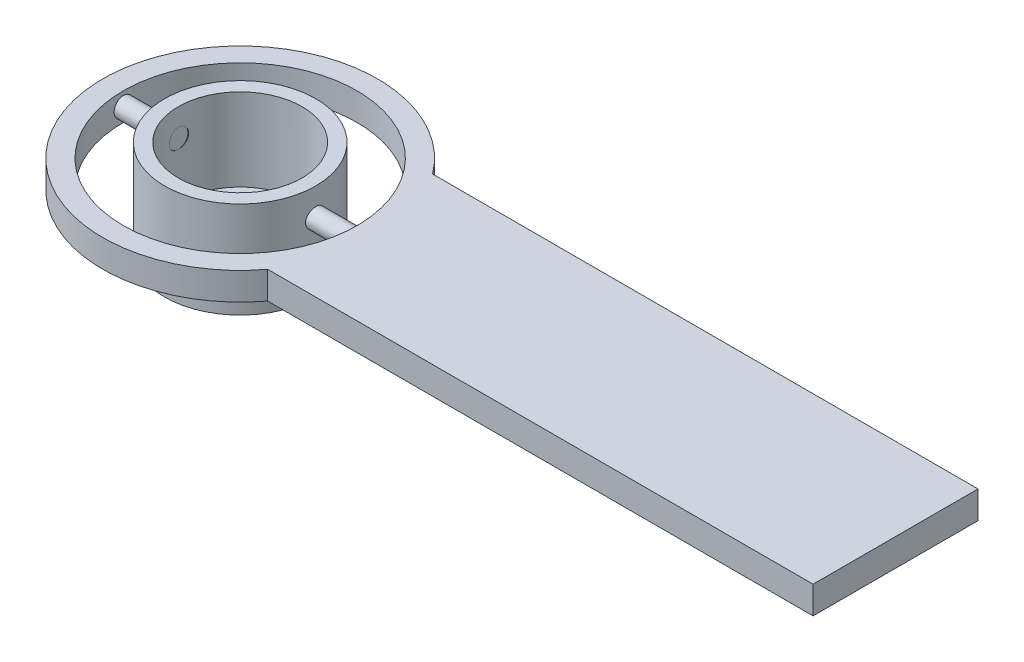
ISO-10303-21;
HEADER;
FILE_DESCRIPTION(('STEP AP214'),'2;1');
FILE_NAME('part.step','',(''),(''),'','','');
FILE_SCHEMA(('AUTOMOTIVE_DESIGN { 1 0 10303 214 1 1 1 1 }'));
ENDSEC;
DATA;
#1=APPLICATION_CONTEXT('core data for automotive mechanical design processes');
#2=APPLICATION_PROTOCOL_DEFINITION('international standard','automotive_design',2000,#1);
#3=PRODUCT_CONTEXT('',#1,'mechanical');
#4=PRODUCT('Part','Part','',(#3));
#5=PRODUCT_RELATED_PRODUCT_CATEGORY('part','',(#4));
#6=PRODUCT_DEFINITION_FORMATION('','',#4);
#7=PRODUCT_DEFINITION_CONTEXT('part definition',#1,'design');
#8=PRODUCT_DEFINITION('design','',#6,#7);
#9=PRODUCT_DEFINITION_SHAPE('','',#8);
#10=(LENGTH_UNIT() NAMED_UNIT(*) SI_UNIT(.MILLI.,.METRE.));
#11=(NAMED_UNIT(*) PLANE_ANGLE_UNIT() SI_UNIT($,.RADIAN.));
#12=(NAMED_UNIT(*) SI_UNIT($,.STERADIAN.) SOLID_ANGLE_UNIT());
#13=UNCERTAINTY_MEASURE_WITH_UNIT(LENGTH_MEASURE(1.E-05),#10,'distance_accuracy_value','');
#14=(GEOMETRIC_REPRESENTATION_CONTEXT(3) GLOBAL_UNCERTAINTY_ASSIGNED_CONTEXT((#13)) GLOBAL_UNIT_ASSIGNED_CONTEXT((#10,
#11,#12)) REPRESENTATION_CONTEXT('',''));
#15=CARTESIAN_POINT('',(0.,0.,0.));
#16=DIRECTION('',(0.,0.,1.));
#17=DIRECTION('',(1.,0.,0.));
#18=AXIS2_PLACEMENT_3D('',#15,#16,#17);
#19=CARTESIAN_POINT('',(0.,-5.,0.));
#20=DIRECTION('',(0.,1.,0.));
#21=DIRECTION('',(0.,0.,1.));
#22=AXIS2_PLACEMENT_3D('',#19,#20,#21);
#23=CYLINDRICAL_SURFACE('',#22,42.5);
#24=CARTESIAN_POINT('',(0.,5.,0.));
#25=DIRECTION('',(0.,1.,0.));
#26=DIRECTION('',(0.,0.,1.));
#27=AXIS2_PLACEMENT_3D('',#24,#25,#26);
#28=CIRCLE('',#27,42.5);
#29=CARTESIAN_POINT('',(0.,5.,42.5));
#30=VERTEX_POINT('',#29);
#31=EDGE_CURVE('E187',#30,#30,#28,.T.);
#32=ORIENTED_EDGE('',*,*,#31,.T.);
#33=EDGE_LOOP('',(#32));
#34=FACE_BOUND('',#33,.T.);
#35=CARTESIAN_POINT('',(0.,-5.,0.));
#36=DIRECTION('',(0.,1.,0.));
#37=DIRECTION('',(0.,0.,1.));
#38=AXIS2_PLACEMENT_3D('',#35,#36,#37);
#39=CIRCLE('',#38,42.5);
#40=CARTESIAN_POINT('',(0.,-5.,42.5));
#41=VERTEX_POINT('',#40);
#42=EDGE_CURVE('E218',#41,#41,#39,.T.);
#43=ORIENTED_EDGE('',*,*,#42,.F.);
#44=EDGE_LOOP('',(#43));
#45=FACE_BOUND('',#44,.T.);
#46=CARTESIAN_POINT('',(42.3556371690947,0.,-3.5));
#47=CARTESIAN_POINT('',(42.3556390824974,-0.196238562845595,-3.49999142396466));
#48=CARTESIAN_POINT('',(42.3570156431992,-0.392610925565576,-3.48344037676546));
#49=CARTESIAN_POINT('',(42.362373136931,-0.779922876674009,-3.41765842155794));
#50=CARTESIAN_POINT('',(42.3663570251593,-0.970856043611473,-3.36839043056702));
#51=CARTESIAN_POINT('',(42.3764749055132,-1.34162393102458,-3.23860861566859));
#52=CARTESIAN_POINT('',(42.3826076829928,-1.52146485392668,-3.15811244054555));
#53=CARTESIAN_POINT('',(42.3963308123219,-1.8650395927381,-2.9681904928212));
#54=CARTESIAN_POINT('',(42.4039208512832,-2.0287768548663,-2.85877092845301));
#55=CARTESIAN_POINT('',(42.419724696405,-2.33595043375593,-2.61381126613576));
#56=CARTESIAN_POINT('',(42.4279398531564,-2.47934076017376,-2.47821357933678));
#57=CARTESIAN_POINT('',(42.4440559131641,-2.74135510608754,-2.18486852075023));
#58=CARTESIAN_POINT('',(42.4519568027125,-2.85997804621193,-2.02712018413027));
#59=CARTESIAN_POINT('',(42.4665668581017,-3.06924288660358,-1.69367801019659));
#60=CARTESIAN_POINT('',(42.4732743263355,-3.15984506118019,-1.5179591607319));
#61=CARTESIAN_POINT('',(42.484727249011,-3.31024239322861,-1.15373848914464));
#62=CARTESIAN_POINT('',(42.4894727370791,-3.37003807869987,-0.965236886171281));
#63=CARTESIAN_POINT('',(42.496457577203,-3.45699285033513,-0.581258796771895));
#64=CARTESIAN_POINT('',(42.4987026354703,-3.48422625712401,-0.385799246257355));
#65=CARTESIAN_POINT('',(42.50045298983,-3.50551315243999,0.0069285738195056));
#66=CARTESIAN_POINT('',(42.4999583358006,-3.49956724501707,0.204196810388299));
#67=CARTESIAN_POINT('',(42.4962897108242,-3.45472510313356,0.594438373880778));
#68=CARTESIAN_POINT('',(42.4931222387046,-3.4159087906562,0.787420954125839));
#69=CARTESIAN_POINT('',(42.4844717400003,-3.3065519496229,1.16412243392015));
#70=CARTESIAN_POINT('',(42.4789886918215,-3.23601112521537,1.34784124706102));
#71=CARTESIAN_POINT('',(42.4663127361263,-3.06511850444177,1.70105452805894));
#72=CARTESIAN_POINT('',(42.45911777639,-2.9647308917579,1.87053159053581));
#73=CARTESIAN_POINT('',(42.4438266196338,-2.73702033879631,2.19026056185741));
#74=CARTESIAN_POINT('',(42.4357304047691,-2.60969686514175,2.34051208990859));
#75=CARTESIAN_POINT('',(42.4195183197154,-2.33127834104207,2.61799215487233));
#76=CARTESIAN_POINT('',(42.4114024625222,-2.18011384764526,2.74515102506004));
#77=CARTESIAN_POINT('',(42.3960899915867,-1.85854636547038,2.97229802875737));
#78=CARTESIAN_POINT('',(42.3888933785767,-1.68814336136661,3.07228614062213));
#79=CARTESIAN_POINT('',(42.3762328603373,-1.33288730553243,3.24225055734327));
#80=CARTESIAN_POINT('',(42.370769161768,-1.14803253361871,3.31222328304051));
#81=CARTESIAN_POINT('',(42.362197054903,-0.769143466624363,3.42011926500076));
#82=CARTESIAN_POINT('',(42.3590885982647,-0.575109360041201,3.45804317908412));
#83=CARTESIAN_POINT('',(42.3555867233006,-0.18397905375624,3.50067689798851));
#84=CARTESIAN_POINT('',(42.3551853649273,0.0131064900730963,3.5054838373549));
#85=CARTESIAN_POINT('',(42.3571221697015,0.405280620107081,3.48200156342021));
#86=CARTESIAN_POINT('',(42.3594603079033,0.600369224479479,3.45371265148891));
#87=CARTESIAN_POINT('',(42.3666054134299,0.982732990111804,3.36492265556402));
#88=CARTESIAN_POINT('',(42.3714089086124,1.17001874069163,3.3044668701462));
#89=CARTESIAN_POINT('',(42.3829406074212,1.53178840225704,3.15310528681497));
#90=CARTESIAN_POINT('',(42.3896688412201,1.70627211250188,3.06219901155092));
#91=CARTESIAN_POINT('',(42.404311157744,2.03792932526735,2.85227102392097));
#92=CARTESIAN_POINT('',(42.4122279557951,2.19506172315144,2.73318456414984));
#93=CARTESIAN_POINT('',(42.4283461700472,2.48714053384217,2.47037018473524));
#94=CARTESIAN_POINT('',(42.4365475910306,2.62208657365889,2.32664185090348));
#95=CARTESIAN_POINT('',(42.452334570173,2.86629341331444,2.01820398520797));
#96=CARTESIAN_POINT('',(42.4599185862065,2.97549111565585,1.85344440588786));
#97=CARTESIAN_POINT('',(42.4735940126989,3.16466868475902,1.50787045966564));
#98=CARTESIAN_POINT('',(42.479685437773,3.24464883761565,1.32705624999017));
#99=CARTESIAN_POINT('',(42.4896822310036,3.37301252936571,0.954732104171517));
#100=CARTESIAN_POINT('',(42.4935903012304,3.42143513558018,0.763235712474859));
#101=CARTESIAN_POINT('',(42.498791011139,3.48543688762004,0.374797175975393));
#102=CARTESIAN_POINT('',(42.5000836990535,3.50101663913003,0.177855131668618));
#103=CARTESIAN_POINT('',(42.4999080717487,3.49888343501126,-0.215262150395223));
#104=CARTESIAN_POINT('',(42.4984479133168,3.48126883556045,-0.411437933017632));
#105=CARTESIAN_POINT('',(42.4929467994317,3.4134519866711,-0.798035003218845));
#106=CARTESIAN_POINT('',(42.4889058404068,3.36324969213241,-0.988456282833249));
#107=CARTESIAN_POINT('',(42.4786965662692,3.23170737688277,-1.35814578352328));
#108=CARTESIAN_POINT('',(42.4725283675252,3.15036905941142,-1.53741461404989));
#109=CARTESIAN_POINT('',(42.4587548115147,2.95887495442643,-1.87976808217458));
#110=CARTESIAN_POINT('',(42.4511494777461,2.84871963807198,-2.04285298432047));
#111=CARTESIAN_POINT('',(42.4353285594405,2.60234937998688,-2.34871243994367));
#112=CARTESIAN_POINT('',(42.4271113117974,2.46606170596259,-2.49142832104244));
#113=CARTESIAN_POINT('',(42.4110068308549,2.17142575586439,-2.75201616144308));
#114=CARTESIAN_POINT('',(42.4031196780042,2.01307214226618,-2.86988209241012));
#115=CARTESIAN_POINT('',(42.3885526526316,1.67849888435527,-3.07757984890701));
#116=CARTESIAN_POINT('',(42.3818750270933,1.50224691825686,-3.1673597183125));
#117=CARTESIAN_POINT('',(42.3705105970598,1.13723578384828,-3.31593660476885));
#118=CARTESIAN_POINT('',(42.3658215026415,0.94849129277366,-3.3747692784103));
#119=CARTESIAN_POINT('',(42.3601722277646,0.63219251740419,-3.44478130227619));
#120=CARTESIAN_POINT('',(42.3584793868734,0.506673085525695,-3.46546082815173));
#121=CARTESIAN_POINT('',(42.3562112394166,0.254121139050787,-3.49307293607272));
#122=CARTESIAN_POINT('',(42.355635929931,0.127088628408903,-3.50000555403868));
#123=CARTESIAN_POINT('',(42.3556371690947,0.,-3.5));
#124=B_SPLINE_CURVE_WITH_KNOTS('',3,(#46,#47,#48,#49,#50,#51,#52,#53,#54,#55,#56,#57,#58,#59,
#60,#61,#62,#63,#64,#65,#66,#67,#68,#69,#70,#71,#72,#73,#74,#75,#76,#77,#78,#79,#80,#81,#82,#83,
#84,#85,#86,#87,#88,#89,#90,#91,#92,#93,#94,#95,#96,#97,#98,#99,#100,#101,#102,#103,#104,#105,
#106,#107,#108,#109,#110,#111,#112,#113,#114,#115,#116,#117,#118,#119,#120,#121,#122,#123),
.UNSPECIFIED.,.T.,.F.,(4,2,2,2,2,2,2,2,2,2,2,2,2,2,2,2,2,2,2,2,2,2,2,2,2,2,2,2,2,2,2,2,2,2,2,2,
2,2,4),(0.,0.588251667803966,1.17717122943579,1.76575844358384,2.35421942343748,
2.94399001266809,3.53378629895001,4.1244149601432,4.71503349808014,5.30430141048681,
5.89355859494112,6.48138714386103,7.06922117477629,7.65776347675657,8.24631743398799,
8.83661848805551,9.4269200123695,10.0172919071315,10.6076516838755,11.1962791515735,
11.7849012592901,12.3726966330962,12.9605012217826,13.5496697057033,14.1388480935223,
14.7294556241908,15.3200573715435,15.9099265752769,16.4997849006074,17.0878981999208,
17.6760123131628,18.2640942592867,18.852166590846,19.4419000639927,20.0317764360423,
20.6227376485765,21.2130164705687,21.5939828407072,21.9749482153838),.UNSPECIFIED.);
#125=CARTESIAN_POINT('',(42.3556371690947,0.,-3.5));
#126=VERTEX_POINT('',#125);
#127=EDGE_CURVE('E12',#126,#126,#124,.T.);
#128=ORIENTED_EDGE('',*,*,#127,.F.);
#129=EDGE_LOOP('',(#128));
#130=FACE_BOUND('',#129,.T.);
#131=CARTESIAN_POINT('',(-42.3556371690947,0.,3.5));
#132=CARTESIAN_POINT('',(-42.3556390824974,-0.196238562845595,3.49999142396466));
#133=CARTESIAN_POINT('',(-42.3570156431992,-0.392610925565576,3.48344037676546));
#134=CARTESIAN_POINT('',(-42.362373136931,-0.779922876674009,3.41765842155794));
#135=CARTESIAN_POINT('',(-42.3663570251593,-0.970856043611473,3.36839043056702));
#136=CARTESIAN_POINT('',(-42.3764749055132,-1.34162393102458,3.23860861566859));
#137=CARTESIAN_POINT('',(-42.3826076829928,-1.52146485392668,3.15811244054555));
#138=CARTESIAN_POINT('',(-42.3963308123219,-1.8650395927381,2.9681904928212));
#139=CARTESIAN_POINT('',(-42.4039208512832,-2.0287768548663,2.85877092845301));
#140=CARTESIAN_POINT('',(-42.419724696405,-2.33595043375593,2.61381126613576));
#141=CARTESIAN_POINT('',(-42.4279398531564,-2.47934076017376,2.47821357933678));
#142=CARTESIAN_POINT('',(-42.4440559131641,-2.74135510608754,2.18486852075023));
#143=CARTESIAN_POINT('',(-42.4519568027125,-2.85997804621193,2.02712018413027));
#144=CARTESIAN_POINT('',(-42.4665668581017,-3.06924288660358,1.69367801019659));
#145=CARTESIAN_POINT('',(-42.4732743263355,-3.15984506118019,1.5179591607319));
#146=CARTESIAN_POINT('',(-42.484727249011,-3.31024239322861,1.15373848914464));
#147=CARTESIAN_POINT('',(-42.4894727370791,-3.37003807869987,0.965236886171281));
#148=CARTESIAN_POINT('',(-42.496457577203,-3.45699285033513,0.581258796771895));
#149=CARTESIAN_POINT('',(-42.4987026354703,-3.48422625712401,0.385799246257355));
#150=CARTESIAN_POINT('',(-42.50045298983,-3.50551315243999,-0.00692857381950514));
#151=CARTESIAN_POINT('',(-42.4999583358006,-3.49956724501707,-0.204196810388298));
#152=CARTESIAN_POINT('',(-42.4962897108242,-3.45472510313356,-0.594438373880777));
#153=CARTESIAN_POINT('',(-42.4931222387046,-3.4159087906562,-0.787420954125838));
#154=CARTESIAN_POINT('',(-42.4844717400003,-3.3065519496229,-1.16412243392015));
#155=CARTESIAN_POINT('',(-42.4789886918215,-3.23601112521537,-1.34784124706101));
#156=CARTESIAN_POINT('',(-42.4663127361263,-3.06511850444177,-1.70105452805894));
#157=CARTESIAN_POINT('',(-42.45911777639,-2.9647308917579,-1.87053159053581));
#158=CARTESIAN_POINT('',(-42.4438266196338,-2.73702033879631,-2.19026056185741));
#159=CARTESIAN_POINT('',(-42.4357304047691,-2.60969686514175,-2.34051208990859));
#160=CARTESIAN_POINT('',(-42.4195183197154,-2.33127834104207,-2.61799215487233));
#161=CARTESIAN_POINT('',(-42.4114024625222,-2.18011384764526,-2.74515102506004));
#162=CARTESIAN_POINT('',(-42.3960899915867,-1.85854636547038,-2.97229802875737));
#163=CARTESIAN_POINT('',(-42.3888933785767,-1.68814336136661,-3.07228614062213));
#164=CARTESIAN_POINT('',(-42.3762328603373,-1.33288730553243,-3.24225055734327));
#165=CARTESIAN_POINT('',(-42.370769161768,-1.14803253361871,-3.31222328304051));
#166=CARTESIAN_POINT('',(-42.362197054903,-0.769143466624364,-3.42011926500076));
#167=CARTESIAN_POINT('',(-42.3590885982647,-0.575109360041202,-3.45804317908412));
#168=CARTESIAN_POINT('',(-42.3555867233006,-0.183979053756241,-3.50067689798851));
#169=CARTESIAN_POINT('',(-42.3551853649273,0.0131064900730951,-3.5054838373549));
#170=CARTESIAN_POINT('',(-42.3571221697015,0.40528062010708,-3.48200156342021));
#171=CARTESIAN_POINT('',(-42.3594603079033,0.600369224479478,-3.45371265148891));
#172=CARTESIAN_POINT('',(-42.3666054134299,0.982732990111803,-3.36492265556402));
#173=CARTESIAN_POINT('',(-42.3714089086124,1.17001874069163,-3.30446687014621));
#174=CARTESIAN_POINT('',(-42.3829406074212,1.53178840225704,-3.15310528681497));
#175=CARTESIAN_POINT('',(-42.3896688412201,1.70627211250188,-3.06219901155092));
#176=CARTESIAN_POINT('',(-42.404311157744,2.03792932526735,-2.85227102392097));
#177=CARTESIAN_POINT('',(-42.4122279557951,2.19506172315144,-2.73318456414984));
#178=CARTESIAN_POINT('',(-42.4283461700472,2.48714053384217,-2.47037018473524));
#179=CARTESIAN_POINT('',(-42.4365475910306,2.62208657365889,-2.32664185090348));
#180=CARTESIAN_POINT('',(-42.452334570173,2.86629341331444,-2.01820398520797));
#181=CARTESIAN_POINT('',(-42.4599185862065,2.97549111565586,-1.85344440588786));
#182=CARTESIAN_POINT('',(-42.4735940126989,3.16466868475902,-1.50787045966564));
#183=CARTESIAN_POINT('',(-42.479685437773,3.24464883761565,-1.32705624999017));
#184=CARTESIAN_POINT('',(-42.4896822310036,3.37301252936571,-0.954732104171519));
#185=CARTESIAN_POINT('',(-42.4935903012304,3.42143513558017,-0.763235712474861));
#186=CARTESIAN_POINT('',(-42.498791011139,3.48543688762004,-0.374797175975395));
#187=CARTESIAN_POINT('',(-42.5000836990535,3.50101663913003,-0.17785513166862));
#188=CARTESIAN_POINT('',(-42.4999080717487,3.49888343501126,0.215262150395221));
#189=CARTESIAN_POINT('',(-42.4984479133168,3.48126883556045,0.411437933017631));
#190=CARTESIAN_POINT('',(-42.4929467994317,3.4134519866711,0.798035003218843));
#191=CARTESIAN_POINT('',(-42.4889058404068,3.36324969213241,0.988456282833247));
#192=CARTESIAN_POINT('',(-42.4786965662692,3.23170737688277,1.35814578352328));
#193=CARTESIAN_POINT('',(-42.4725283675252,3.15036905941142,1.53741461404989));
#194=CARTESIAN_POINT('',(-42.4587548115147,2.95887495442644,1.87976808217458));
#195=CARTESIAN_POINT('',(-42.4511494777461,2.84871963807198,2.04285298432047));
#196=CARTESIAN_POINT('',(-42.4353285594405,2.60234937998688,2.34871243994366));
#197=CARTESIAN_POINT('',(-42.4271113117974,2.46606170596259,2.49142832104243));
#198=CARTESIAN_POINT('',(-42.4110068308549,2.17142575586439,2.75201616144308));
#199=CARTESIAN_POINT('',(-42.4031196780042,2.01307214226619,2.86988209241011));
#200=CARTESIAN_POINT('',(-42.3885526526316,1.67849888435527,3.07757984890701));
#201=CARTESIAN_POINT('',(-42.3818750270933,1.50224691825686,3.16735971831249));
#202=CARTESIAN_POINT('',(-42.3705105970598,1.13723578384829,3.31593660476885));
#203=CARTESIAN_POINT('',(-42.3658215026415,0.948491292773664,3.3747692784103));
#204=CARTESIAN_POINT('',(-42.3601722277646,0.632192517404193,3.44478130227619));
#205=CARTESIAN_POINT('',(-42.3584793868734,0.506673085525699,3.46546082815173));
#206=CARTESIAN_POINT('',(-42.3562112394166,0.254121139050789,3.49307293607272));
#207=CARTESIAN_POINT('',(-42.355635929931,0.127088628408904,3.50000555403868));
#208=CARTESIAN_POINT('',(-42.3556371690947,0.,3.5));
#209=B_SPLINE_CURVE_WITH_KNOTS('',3,(#131,#132,#133,#134,#135,#136,#137,#138,#139,#140,#141,
#142,#143,#144,#145,#146,#147,#148,#149,#150,#151,#152,#153,#154,#155,#156,#157,#158,#159,#160,
#161,#162,#163,#164,#165,#166,#167,#168,#169,#170,#171,#172,#173,#174,#175,#176,#177,#178,#179,
#180,#181,#182,#183,#184,#185,#186,#187,#188,#189,#190,#191,#192,#193,#194,#195,#196,#197,#198,
#199,#200,#201,#202,#203,#204,#205,#206,#207,#208),.UNSPECIFIED.,.T.,.F.,(4,2,2,2,2,2,2,2,2,2,2,
2,2,2,2,2,2,2,2,2,2,2,2,2,2,2,2,2,2,2,2,2,2,2,2,2,2,2,4),(0.,0.588251667803966,1.17717122943579,
1.76575844358384,2.35421942343748,2.94399001266809,3.53378629895001,4.1244149601432,
4.71503349808014,5.30430141048681,5.89355859494112,6.48138714386103,7.06922117477629,
7.65776347675657,8.24631743398799,8.83661848805551,9.42692001236949,10.0172919071315,
10.6076516838755,11.1962791515735,11.7849012592901,12.3726966330962,12.9605012217826,
13.5496697057033,14.1388480935223,14.7294556241908,15.3200573715435,15.9099265752769,
16.4997849006074,17.0878981999208,17.6760123131628,18.2640942592867,18.852166590846,
19.4419000639927,20.0317764360423,20.6227376485765,21.2130164705687,21.5939828407072,
21.9749482153838),.UNSPECIFIED.);
#210=CARTESIAN_POINT('',(-42.3556371690947,0.,3.5));
#211=VERTEX_POINT('',#210);
#212=EDGE_CURVE('E122',#211,#211,#209,.T.);
#213=ORIENTED_EDGE('',*,*,#212,.F.);
#214=EDGE_LOOP('',(#213));
#215=FACE_BOUND('',#214,.T.);
#216=ADVANCED_FACE('F59',(#34,#45,#130,#215),#23,.F.);
#217=CARTESIAN_POINT('',(27.501,0.,0.));
#218=DIRECTION('',(-1.,0.,0.));
#219=DIRECTION('',(0.,0.,1.));
#220=AXIS2_PLACEMENT_3D('',#217,#218,#219);
#221=CYLINDRICAL_SURFACE('',#220,3.5);
#222=CARTESIAN_POINT('',(-22.5,0.,0.));
#223=DIRECTION('',(1.,0.,0.));
#224=DIRECTION('',(0.,0.,-1.));
#225=AXIS2_PLACEMENT_3D('',#222,#223,#224);
#226=CIRCLE('',#225,3.5);
#227=CARTESIAN_POINT('',(-22.5,3.5,0.));
#228=VERTEX_POINT('',#227);
#229=CARTESIAN_POINT('',(-22.5,-3.5,0.));
#230=VERTEX_POINT('',#229);
#231=EDGE_CURVE('E123',#228,#230,#226,.T.);
#232=ORIENTED_EDGE('',*,*,#231,.F.);
#233=CARTESIAN_POINT('',(-22.2261107708929,0.,3.5));
#234=CARTESIAN_POINT('',(-22.2261141274381,0.19531622600666,3.49999199932989));
#235=CARTESIAN_POINT('',(-22.2287132114458,0.390743671342416,3.48359536070723));
#236=CARTESIAN_POINT('',(-22.2388209026934,0.776128377761643,3.41846300815229));
#237=CARTESIAN_POINT('',(-22.2463342144307,0.966080214810538,3.3696963049871));
#238=CARTESIAN_POINT('',(-22.2653992658192,1.33487989252108,3.24132348210851));
#239=CARTESIAN_POINT('',(-22.2769478168358,1.51373636968556,3.16174170702204));
#240=CARTESIAN_POINT('',(-22.3027783375543,1.85553417195683,2.97405620485814));
#241=CARTESIAN_POINT('',(-22.3170599530873,2.01847755506141,2.86595617268124));
#242=CARTESIAN_POINT('',(-22.3468847405485,2.32524867680305,2.62331013798504));
#243=CARTESIAN_POINT('',(-22.3624367736815,2.46891968908001,2.4885670540169));
#244=CARTESIAN_POINT('',(-22.3929711076182,2.73170860007246,2.19688547464603));
#245=CARTESIAN_POINT('',(-22.4079533762861,2.8508251155327,2.03994572965387));
#246=CARTESIAN_POINT('',(-22.4357531554861,3.061705324158,1.70731791031633));
#247=CARTESIAN_POINT('',(-22.4485590545345,3.15332418248335,1.53153696002179));
#248=CARTESIAN_POINT('',(-22.4704649182686,3.30567842295971,1.16684873211662));
#249=CARTESIAN_POINT('',(-22.4795650932445,3.36641555761535,0.977942200060336));
#250=CARTESIAN_POINT('',(-22.4929716378829,3.45480573232831,0.593981035483121));
#251=CARTESIAN_POINT('',(-22.4973160606297,3.48272152727484,0.398988240953517));
#252=CARTESIAN_POINT('',(-22.5008521262826,3.50549284955333,0.00704109791545041));
#253=CARTESIAN_POINT('',(-22.5000440761977,3.5003503466578,-0.189913133022986));
#254=CARTESIAN_POINT('',(-22.4933965552525,3.4573576189065,-0.578398429706621));
#255=CARTESIAN_POINT('',(-22.4876005752428,3.41979010649582,-0.769961632640021));
#256=CARTESIAN_POINT('',(-22.471676886101,3.3134579834311,-1.14403161700396));
#257=CARTESIAN_POINT('',(-22.4615490587275,3.24469252119906,-1.32653815107315));
#258=CARTESIAN_POINT('',(-22.4380251015873,3.0776298077764,-1.67816499605679));
#259=CARTESIAN_POINT('',(-22.424615931438,2.97921435466676,-1.84722823970001));
#260=CARTESIAN_POINT('',(-22.3960222427278,2.75573170628052,-2.1665472496407));
#261=CARTESIAN_POINT('',(-22.3808375986714,2.63066262653408,-2.31680168492121));
#262=CARTESIAN_POINT('',(-22.3501953598738,2.35585025004684,-2.59590566546295));
#263=CARTESIAN_POINT('',(-22.334736576738,2.20586003262427,-2.72451207619521));
#264=CARTESIAN_POINT('',(-22.3054445550795,1.88629972137738,-2.95476856027025));
#265=CARTESIAN_POINT('',(-22.2916113280541,1.71672948908445,-3.05641844296145));
#266=CARTESIAN_POINT('',(-22.2671366787338,1.36256002006903,-3.22991404443639));
#267=CARTESIAN_POINT('',(-22.2564980825166,1.17794765901405,-3.30173339552143));
#268=CARTESIAN_POINT('',(-22.2396661439954,0.799078087169444,-3.41327734162307));
#269=CARTESIAN_POINT('',(-22.2334724634806,0.604821611397052,-3.4530043785519));
#270=CARTESIAN_POINT('',(-22.2262962033391,0.214345169903353,-3.49889967595408));
#271=CARTESIAN_POINT('',(-22.2252600102673,0.0181667391653879,-3.50541321697519));
#272=CARTESIAN_POINT('',(-22.2283735578185,-0.372479188601877,-3.48561408152108));
#273=CARTESIAN_POINT('',(-22.2325231249271,-0.566946742657487,-3.45930250336717));
#274=CARTESIAN_POINT('',(-22.2454912996713,-0.947572290332169,-3.37489336532265));
#275=CARTESIAN_POINT('',(-22.2542844545574,-1.13376964143558,-3.31696902609833));
#276=CARTESIAN_POINT('',(-22.2755279299359,-1.49381307924929,-3.17115929002653));
#277=CARTESIAN_POINT('',(-22.287978443484,-1.66765851335532,-3.08327231154577));
#278=CARTESIAN_POINT('',(-22.3152595291601,-1.9996075065717,-2.879207239903));
#279=CARTESIAN_POINT('',(-22.3301085139179,-2.15757256751682,-2.76280635888511));
#280=CARTESIAN_POINT('',(-22.3604585024315,-2.4518504145764,-2.50532611597574));
#281=CARTESIAN_POINT('',(-22.3759595458903,-2.58816187980815,-2.3642452496921));
#282=CARTESIAN_POINT('',(-22.4060352917262,-2.8365098698539,-2.05988623823672));
#283=CARTESIAN_POINT('',(-22.420600411578,-2.94831710360054,-1.89641991032536));
#284=CARTESIAN_POINT('',(-22.4470127819162,-3.14288258666365,-1.55282440307782));
#285=CARTESIAN_POINT('',(-22.4588601112561,-3.22564167881464,-1.37269570739343));
#286=CARTESIAN_POINT('',(-22.4784601514089,-3.3593983547314,-1.00159331862635));
#287=CARTESIAN_POINT('',(-22.4862287819182,-3.41051956719214,-0.810665061627113));
#288=CARTESIAN_POINT('',(-22.4968630928652,-3.47994882110329,-0.4228037830431));
#289=CARTESIAN_POINT('',(-22.499729122652,-3.49825920058958,-0.225871190332697));
#290=CARTESIAN_POINT('',(-22.5002313450679,-3.50148666528254,0.166188208897424));
#291=CARTESIAN_POINT('',(-22.4979223828698,-3.48675394398843,0.361312152194307));
#292=CARTESIAN_POINT('',(-22.4884450879238,-3.42506623710617,0.746271607267873));
#293=CARTESIAN_POINT('',(-22.4812767742656,-3.37811137810216,0.93610713981694));
#294=CARTESIAN_POINT('',(-22.4628827065204,-3.25343983426105,1.30499271033077));
#295=CARTESIAN_POINT('',(-22.4516603880013,-3.17574919118791,1.48405173140909));
#296=CARTESIAN_POINT('',(-22.4263884871186,-2.99184927345523,1.82664746653963));
#297=CARTESIAN_POINT('',(-22.412338799153,-2.88563893353758,1.99018360047731));
#298=CARTESIAN_POINT('',(-22.3827957094145,-2.64645617431542,2.29886379111357));
#299=CARTESIAN_POINT('',(-22.3672892325369,-2.51322584519353,2.4438067729095));
#300=CARTESIAN_POINT('',(-22.3366749331415,-2.22432754261112,2.70940464310382));
#301=CARTESIAN_POINT('',(-22.3215672049379,-2.06865431611924,2.83005382935615));
#302=CARTESIAN_POINT('',(-22.2933622652195,-1.73817274845835,3.04430309276387));
#303=CARTESIAN_POINT('',(-22.2802778300441,-1.56325386825404,3.13773433039402));
#304=CARTESIAN_POINT('',(-22.2577510719313,-1.20008084138986,3.29374927814051));
#305=CARTESIAN_POINT('',(-22.24830501676,-1.01184059569863,3.35636461748451));
#306=CARTESIAN_POINT('',(-22.2362788979994,-0.685658405740137,3.43495590873849));
#307=CARTESIAN_POINT('',(-22.2324863811603,-0.549718875196619,3.45930954507756));
#308=CARTESIAN_POINT('',(-22.2274011502965,-0.275871374742544,3.49183429886821));
#309=CARTESIAN_POINT('',(-22.2261083999659,-0.137963433450059,3.50000565134777));
#310=CARTESIAN_POINT('',(-22.2261107708929,0.,3.5));
#311=B_SPLINE_CURVE_WITH_KNOTS('',3,(#233,#234,#235,#236,#237,#238,#239,#240,#241,#242,#243,
#244,#245,#246,#247,#248,#249,#250,#251,#252,#253,#254,#255,#256,#257,#258,#259,#260,#261,#262,
#263,#264,#265,#266,#267,#268,#269,#270,#271,#272,#273,#274,#275,#276,#277,#278,#279,#280,#281,
#282,#283,#284,#285,#286,#287,#288,#289,#290,#291,#292,#293,#294,#295,#296,#297,#298,#299,#300,
#301,#302,#303,#304,#305,#306,#307,#308,#309,#310),.UNSPECIFIED.,.T.,.F.,(4,2,2,2,2,2,2,2,2,2,2,
2,2,2,2,2,2,2,2,2,2,2,2,2,2,2,2,2,2,2,2,2,2,2,2,2,2,2,4),(0.,0.585444332011793,1.17144994457482,
1.75699354047962,2.3424613090399,2.93243379464048,3.52243950672744,4.11550043787179,
4.70852770968834,5.29677439130335,5.8849860226744,6.46812027914766,7.05127045378839,
7.63677687419945,8.22232470493977,8.81406410301299,9.40580768608546,9.99807321364631,
10.5902936713285,11.1763447928384,11.7623763057318,12.3452284633785,12.9281113927181,
13.515702573049,14.1033295830518,14.6962402975511,15.2891338072689,15.8796956413697,
16.4702153915137,17.05450637065,17.6387950544221,18.2225897396632,18.8064062336409,
19.396082460622,19.9858969332119,20.5792958432814,21.1720844158916,21.5856244729568,
21.9991585238117),.UNSPECIFIED.);
#312=EDGE_CURVE('E116',#230,#228,#311,.T.);
#313=ORIENTED_EDGE('',*,*,#312,.F.);
#314=EDGE_LOOP('',(#232,#313));
#315=FACE_BOUND('',#314,.T.);
#316=ADVANCED_FACE('F124',(#315),#221,.F.);
#317=CARTESIAN_POINT('',(0.,-5.,0.));
#318=DIRECTION('',(0.,1.,0.));
#319=DIRECTION('',(0.,0.,1.));
#320=AXIS2_PLACEMENT_3D('',#317,#318,#319);
#321=CYLINDRICAL_SURFACE('',#320,50.);
#322=DIRECTION('',(0.,1.,0.));
#323=VECTOR('',#322,1.);
#324=CARTESIAN_POINT('',(40.,-5.,30.));
#325=LINE('',#324,#323);
#326=CARTESIAN_POINT('',(40.,-5.,30.));
#327=VERTEX_POINT('',#326);
#328=CARTESIAN_POINT('',(40.,5.,30.));
#329=VERTEX_POINT('',#328);
#330=EDGE_CURVE('E257',#327,#329,#325,.T.);
#331=ORIENTED_EDGE('',*,*,#330,.T.);
#332=CARTESIAN_POINT('',(0.,5.,0.));
#333=DIRECTION('',(0.,1.,0.));
#334=DIRECTION('',(0.,0.,1.));
#335=AXIS2_PLACEMENT_3D('',#332,#333,#334);
#336=CIRCLE('',#335,50.);
#337=CARTESIAN_POINT('',(40.,5.,-30.));
#338=VERTEX_POINT('',#337);
#339=EDGE_CURVE('E227',#338,#329,#336,.T.);
#340=ORIENTED_EDGE('',*,*,#339,.F.);
#341=DIRECTION('',(0.,1.,0.));
#342=VECTOR('',#341,1.);
#343=CARTESIAN_POINT('',(40.,-5.,-30.));
#344=LINE('',#343,#342);
#345=CARTESIAN_POINT('',(40.,-5.,-30.));
#346=VERTEX_POINT('',#345);
#347=EDGE_CURVE('E72',#346,#338,#344,.T.);
#348=ORIENTED_EDGE('',*,*,#347,.F.);
#349=CARTESIAN_POINT('',(0.,-5.,0.));
#350=DIRECTION('',(0.,1.,0.));
#351=DIRECTION('',(0.,0.,1.));
#352=AXIS2_PLACEMENT_3D('',#349,#350,#351);
#353=CIRCLE('',#352,50.);
#354=EDGE_CURVE('E243',#346,#327,#353,.T.);
#355=ORIENTED_EDGE('',*,*,#354,.T.);
#356=EDGE_LOOP('',(#331,#340,#348,#355));
#357=FACE_BOUND('',#356,.T.);
#358=ADVANCED_FACE('F211',(#357),#321,.T.);
#359=CARTESIAN_POINT('',(0.,-5.,-30.));
#360=DIRECTION('',(0.,0.,1.));
#361=DIRECTION('',(1.,0.,0.));
#362=AXIS2_PLACEMENT_3D('',#359,#360,#361);
#363=PLANE('',#362);
#364=ORIENTED_EDGE('',*,*,#347,.T.);
#365=DIRECTION('',(1.,0.,0.));
#366=VECTOR('',#365,1.);
#367=CARTESIAN_POINT('',(0.,5.,-30.));
#368=LINE('',#367,#366);
#369=CARTESIAN_POINT('',(238.383087675041,5.,-30.));
#370=VERTEX_POINT('',#369);
#371=EDGE_CURVE('E237',#338,#370,#368,.T.);
#372=ORIENTED_EDGE('',*,*,#371,.T.);
#373=DIRECTION('',(0.,1.,0.));
#374=VECTOR('',#373,1.);
#375=CARTESIAN_POINT('',(238.383087675041,-5.,-30.));
#376=LINE('',#375,#374);
#377=CARTESIAN_POINT('',(238.383087675041,-5.,-30.));
#378=VERTEX_POINT('',#377);
#379=EDGE_CURVE('E262',#378,#370,#376,.T.);
#380=ORIENTED_EDGE('',*,*,#379,.F.);
#381=DIRECTION('',(1.,0.,0.));
#382=VECTOR('',#381,1.);
#383=CARTESIAN_POINT('',(0.,-5.,-30.));
#384=LINE('',#383,#382);
#385=EDGE_CURVE('E254',#346,#378,#384,.T.);
#386=ORIENTED_EDGE('',*,*,#385,.F.);
#387=EDGE_LOOP('',(#364,#372,#380,#386));
#388=FACE_BOUND('',#387,.T.);
#389=ADVANCED_FACE('F268',(#388),#363,.F.);
#390=CARTESIAN_POINT('',(238.383087675041,-5.,0.));
#391=DIRECTION('',(1.,0.,0.));
#392=DIRECTION('',(0.,0.,-1.));
#393=AXIS2_PLACEMENT_3D('',#390,#391,#392);
#394=PLANE('',#393);
#395=ORIENTED_EDGE('',*,*,#379,.T.);
#396=DIRECTION('',(0.,0.,-1.));
#397=VECTOR('',#396,1.);
#398=CARTESIAN_POINT('',(238.383087675041,5.,0.));
#399=LINE('',#398,#397);
#400=CARTESIAN_POINT('',(238.383087675041,5.,30.));
#401=VERTEX_POINT('',#400);
#402=EDGE_CURVE('E233',#401,#370,#399,.T.);
#403=ORIENTED_EDGE('',*,*,#402,.F.);
#404=DIRECTION('',(0.,1.,0.));
#405=VECTOR('',#404,1.);
#406=CARTESIAN_POINT('',(238.383087675041,-5.,30.));
#407=LINE('',#406,#405);
#408=CARTESIAN_POINT('',(238.383087675041,-5.,30.));
#409=VERTEX_POINT('',#408);
#410=EDGE_CURVE('E260',#409,#401,#407,.T.);
#411=ORIENTED_EDGE('',*,*,#410,.F.);
#412=DIRECTION('',(0.,0.,-1.));
#413=VECTOR('',#412,1.);
#414=CARTESIAN_POINT('',(238.383087675041,-5.,0.));
#415=LINE('',#414,#413);
#416=EDGE_CURVE('E250',#409,#378,#415,.T.);
#417=ORIENTED_EDGE('',*,*,#416,.T.);
#418=EDGE_LOOP('',(#395,#403,#411,#417));
#419=FACE_BOUND('',#418,.T.);
#420=ADVANCED_FACE('F277',(#419),#394,.T.);
#421=CARTESIAN_POINT('',(0.,-5.,30.));
#422=DIRECTION('',(0.,0.,1.));
#423=DIRECTION('',(1.,0.,0.));
#424=AXIS2_PLACEMENT_3D('',#421,#422,#423);
#425=PLANE('',#424);
#426=ORIENTED_EDGE('',*,*,#410,.T.);
#427=DIRECTION('',(1.,0.,0.));
#428=VECTOR('',#427,1.);
#429=CARTESIAN_POINT('',(0.,5.,30.));
#430=LINE('',#429,#428);
#431=EDGE_CURVE('E230',#329,#401,#430,.T.);
#432=ORIENTED_EDGE('',*,*,#431,.F.);
#433=ORIENTED_EDGE('',*,*,#330,.F.);
#434=DIRECTION('',(1.,0.,0.));
#435=VECTOR('',#434,1.);
#436=CARTESIAN_POINT('',(0.,-5.,30.));
#437=LINE('',#436,#435);
#438=EDGE_CURVE('E246',#327,#409,#437,.T.);
#439=ORIENTED_EDGE('',*,*,#438,.T.);
#440=EDGE_LOOP('',(#426,#432,#433,#439));
#441=FACE_BOUND('',#440,.T.);
#442=ADVANCED_FACE('F283',(#441),#425,.T.);
#443=CARTESIAN_POINT('',(0.,-5.,0.));
#444=DIRECTION('',(0.,1.,0.));
#445=DIRECTION('',(0.,0.,1.));
#446=AXIS2_PLACEMENT_3D('',#443,#444,#445);
#447=PLANE('',#446);
#448=ORIENTED_EDGE('',*,*,#42,.T.);
#449=EDGE_LOOP('',(#448));
#450=FACE_BOUND('',#449,.T.);
#451=ORIENTED_EDGE('',*,*,#354,.F.);
#452=ORIENTED_EDGE('',*,*,#385,.T.);
#453=ORIENTED_EDGE('',*,*,#416,.F.);
#454=ORIENTED_EDGE('',*,*,#438,.F.);
#455=EDGE_LOOP('',(#451,#452,#453,#454));
#456=FACE_BOUND('',#455,.T.);
#457=ADVANCED_FACE('F281',(#450,#456),#447,.F.);
#458=CARTESIAN_POINT('',(0.,5.,0.));
#459=DIRECTION('',(0.,1.,0.));
#460=DIRECTION('',(0.,0.,1.));
#461=AXIS2_PLACEMENT_3D('',#458,#459,#460);
#462=PLANE('',#461);
#463=ORIENTED_EDGE('',*,*,#31,.F.);
#464=EDGE_LOOP('',(#463));
#465=FACE_BOUND('',#464,.T.);
#466=ORIENTED_EDGE('',*,*,#339,.T.);
#467=ORIENTED_EDGE('',*,*,#431,.T.);
#468=ORIENTED_EDGE('',*,*,#402,.T.);
#469=ORIENTED_EDGE('',*,*,#371,.F.);
#470=EDGE_LOOP('',(#466,#467,#468,#469));
#471=FACE_BOUND('',#470,.T.);
#472=ADVANCED_FACE('F274',(#465,#471),#462,.T.);
#473=CARTESIAN_POINT('',(-50.001,0.,0.));
#474=DIRECTION('',(1.,0.,0.));
#475=DIRECTION('',(0.,0.,-1.));
#476=AXIS2_PLACEMENT_3D('',#473,#474,#475);
#477=CYLINDRICAL_SURFACE('',#476,3.5);
#478=CARTESIAN_POINT('',(27.2763633939717,0.,-3.5));
#479=CARTESIAN_POINT('',(27.2763662499642,0.195740429198567,-3.49999169590655));
#480=CARTESIAN_POINT('',(27.2784931537421,0.391602471217788,-3.48352416097465));
#481=CARTESIAN_POINT('',(27.2867675349529,0.777873580466447,-3.41809346726577));
#482=CARTESIAN_POINT('',(27.2929191902676,0.968276766529524,-3.36909654066564));
#483=CARTESIAN_POINT('',(27.3085352637987,1.33798178371388,-3.24007674617227));
#484=CARTESIAN_POINT('',(27.3179974086924,1.5172911338173,-3.16007516521395));
#485=CARTESIAN_POINT('',(27.3391655829051,1.85990685696957,-2.97136298005587));
#486=CARTESIAN_POINT('',(27.3508712348121,2.02321591468082,-2.86265720343454));
#487=CARTESIAN_POINT('',(27.3752834750207,2.33017476067181,-2.6189475457856));
#488=CARTESIAN_POINT('',(27.3879949325531,2.47371836907152,-2.48381040116523));
#489=CARTESIAN_POINT('',(27.4129427625964,2.73615420550489,-2.19136101354175));
#490=CARTESIAN_POINT('',(27.425179111246,2.85504519671739,-2.03404765862353));
#491=CARTESIAN_POINT('',(27.4478479489125,3.0651827673339,-1.70104287402368));
#492=CARTESIAN_POINT('',(27.4582741048805,3.15633309976412,-1.52529024136279));
#493=CARTESIAN_POINT('',(27.4760942584874,3.30778536074969,-1.1608170775542));
#494=CARTESIAN_POINT('',(27.4834883726177,3.36808847448298,-0.972097044941759));
#495=CARTESIAN_POINT('',(27.4943770282545,3.45581685151357,-0.588132826421752));
#496=CARTESIAN_POINT('',(27.4978925157364,3.48341877332337,-0.392929607063941));
#497=CARTESIAN_POINT('',(27.5006993662654,3.50550882697567,-0.000632329637501353));
#498=CARTESIAN_POINT('',(27.499990901236,3.49999830656225,0.196461651147269));
#499=CARTESIAN_POINT('',(27.4944466014674,3.45616129526936,0.585743468702436));
#500=CARTESIAN_POINT('',(27.4896346638046,3.41802480163183,0.777953089323093));
#501=CARTESIAN_POINT('',(27.4764509099964,3.31031550642638,1.15322186366624));
#502=CARTESIAN_POINT('',(27.4680790240853,3.24074208877538,1.33628083798145));
#503=CARTESIAN_POINT('',(27.4486748872169,3.071932465037,1.68863904207203));
#504=CARTESIAN_POINT('',(27.437635295315,2.97261422397606,1.85789854942012));
#505=CARTESIAN_POINT('',(27.4141304494456,2.74719392839036,2.17741986434725));
#506=CARTESIAN_POINT('',(27.4016651277177,2.62109060061232,2.32768076826865));
#507=CARTESIAN_POINT('',(27.3765991972101,2.34461607164204,2.60605606425668));
#508=CARTESIAN_POINT('',(27.3639982556505,2.19407926020017,2.73400600301091));
#509=CARTESIAN_POINT('',(27.3401683725073,1.8735793351805,2.96284870388027));
#510=CARTESIAN_POINT('',(27.3289394355141,1.70361615661226,3.0637413754722));
#511=CARTESIAN_POINT('',(27.3091250997485,1.3489395151497,3.23561604225885));
#512=CARTESIAN_POINT('',(27.3005408932999,1.16421944652778,3.3065845520449));
#513=CARTESIAN_POINT('',(27.2870109976592,0.785350091060542,3.41644888670541));
#514=CARTESIAN_POINT('',(27.2820651264506,0.59120127642928,3.45534631602554));
#515=CARTESIAN_POINT('',(27.2764052722712,0.200438938366913,3.49974589441695));
#516=CARTESIAN_POINT('',(27.2756619443603,0.00385213646894453,3.50547962092479));
#517=CARTESIAN_POINT('',(27.2784137041451,-0.387479275482064,3.48400034673192));
#518=CARTESIAN_POINT('',(27.2819086980994,-0.582223926182961,3.45678807471588));
#519=CARTESIAN_POINT('',(27.2927165107423,-0.963647007929915,3.37038436372601));
#520=CARTESIAN_POINT('',(27.3000159070033,-1.15035131517244,3.31130532942305));
#521=CARTESIAN_POINT('',(27.317599166464,-1.51120391954353,3.16296094041903));
#522=CARTESIAN_POINT('',(27.3278831381521,-1.68535175996104,3.07369448839504));
#523=CARTESIAN_POINT('',(27.3503469976997,-2.01719493804142,2.86694092276429));
#524=CARTESIAN_POINT('',(27.3625369487506,-2.17479506742887,2.74930210947204));
#525=CARTESIAN_POINT('',(27.3874077781289,-2.46809708897475,2.48935730150709));
#526=CARTESIAN_POINT('',(27.4000886762511,-2.60379809702232,2.34705031141212));
#527=CARTESIAN_POINT('',(27.4246028546019,-2.85026483628237,2.04079640756325));
#528=CARTESIAN_POINT('',(27.4364306760133,-2.960878287948,1.87672644282514));
#529=CARTESIAN_POINT('',(27.4578241312366,-3.15297571988271,1.5322014195738));
#530=CARTESIAN_POINT('',(27.4673898120694,-3.2344603056456,1.35174670174377));
#531=CARTESIAN_POINT('',(27.4831569883316,-3.36573617189064,0.980078070462058));
#532=CARTESIAN_POINT('',(27.4893677761076,-3.41561506058947,0.788895511367424));
#533=CARTESIAN_POINT('',(27.4977640007099,-3.48254853832192,0.400784682226663));
#534=CARTESIAN_POINT('',(27.4999496260557,-3.49960466462006,0.203856681708673));
#535=CARTESIAN_POINT('',(27.5000482938322,-3.50037899487747,-0.188668916548933));
#536=CARTESIAN_POINT('',(27.4979914095327,-3.48433185311517,-0.384266085251404));
#537=CARTESIAN_POINT('',(27.489896017623,-3.4198526533968,-0.769959326029331));
#538=CARTESIAN_POINT('',(27.4838575135006,-3.37142062380909,-0.960055402923457));
#539=CARTESIAN_POINT('',(27.4684743317555,-3.2436209673352,-1.32931672734497));
#540=CARTESIAN_POINT('',(27.459130901076,-3.1642650068484,-1.50848606766077));
#541=CARTESIAN_POINT('',(27.4381717597557,-2.97689444539633,-1.85100207522513));
#542=CARTESIAN_POINT('',(27.4265560180954,-2.8688794531959,-2.01434852642794));
#543=CARTESIAN_POINT('',(27.4022501870773,-2.62639033155817,-2.3217801335041));
#544=CARTESIAN_POINT('',(27.3895533443199,-2.49174168504495,-2.46572711219906));
#545=CARTESIAN_POINT('',(27.3645701656719,-2.20017064595336,-2.72907400797819));
#546=CARTESIAN_POINT('',(27.3522839276289,-2.04324299036391,-2.84846810852629));
#547=CARTESIAN_POINT('',(27.3294606083315,-1.71084621255654,-3.05973085364472));
#548=CARTESIAN_POINT('',(27.3189307242964,-1.53530539777358,-3.15148742423087));
#549=CARTESIAN_POINT('',(27.3008966787298,-1.1712691524883,-3.30408802176578));
#550=CARTESIAN_POINT('',(27.2933892407194,-0.982788010890107,-3.36496554182568));
#551=CARTESIAN_POINT('',(27.2840656512526,-0.661117986321165,-3.4395681693902));
#552=CARTESIAN_POINT('',(27.2811917658877,-0.529954864480987,-3.46219734590617));
#553=CARTESIAN_POINT('',(27.2773396747629,-0.265879858894334,-3.49241602171365));
#554=CARTESIAN_POINT('',(27.2763614538739,-0.132967989113035,-3.50000564103498));
#555=CARTESIAN_POINT('',(27.2763633939717,0.,-3.5));
#556=B_SPLINE_CURVE_WITH_KNOTS('',3,(#478,#479,#480,#481,#482,#483,#484,#485,#486,#487,#488,
#489,#490,#491,#492,#493,#494,#495,#496,#497,#498,#499,#500,#501,#502,#503,#504,#505,#506,#507,
#508,#509,#510,#511,#512,#513,#514,#515,#516,#517,#518,#519,#520,#521,#522,#523,#524,#525,#526,
#527,#528,#529,#530,#531,#532,#533,#534,#535,#536,#537,#538,#539,#540,#541,#542,#543,#544,#545,
#546,#547,#548,#549,#550,#551,#552,#553,#554,#555),.UNSPECIFIED.,.T.,.F.,(4,2,2,2,2,2,2,2,2,2,2,
2,2,2,2,2,2,2,2,2,2,2,2,2,2,2,2,2,2,2,2,2,2,2,2,2,2,2,4),(0.,0.586735512389744,1.17408105231889,
1.76102404946681,2.34786839516194,2.93775157458384,3.52766434127318,4.11960108706896,
4.71151508841318,5.30021665334218,5.88889425707662,6.47416685437005,7.05945092200267,
7.64636428073667,8.23330554517358,8.82440535122353,9.41550713484146,10.0068750161931,
10.598213310914,11.1854173416595,11.7726083851296,12.3577416272215,12.9428961413928,
13.5312515280614,14.1196306618622,14.7114909357409,15.3033389060653,15.8935390652847,
16.4837115816192,17.0697150070061,17.655717919069,18.2414999686624,18.8272900153975,
19.4170538139749,20.0069571660776,20.5992214127386,21.1908418760132,21.5894190335271,
21.9879930100076),.UNSPECIFIED.);
#557=CARTESIAN_POINT('',(27.2763633939717,0.,-3.5));
#558=VERTEX_POINT('',#557);
#559=EDGE_CURVE('E180',#558,#558,#556,.T.);
#560=ORIENTED_EDGE('',*,*,#559,.T.);
#561=EDGE_LOOP('',(#560));
#562=FACE_BOUND('',#561,.T.);
#563=ORIENTED_EDGE('',*,*,#127,.T.);
#564=EDGE_LOOP('',(#563));
#565=FACE_BOUND('',#564,.T.);
#566=ADVANCED_FACE('F203',(#562,#565),#477,.T.);
#567=CARTESIAN_POINT('',(0.,-25.,0.));
#568=DIRECTION('',(0.,1.,0.));
#569=DIRECTION('',(0.,0.,1.));
#570=AXIS2_PLACEMENT_3D('',#567,#568,#569);
#571=CYLINDRICAL_SURFACE('',#570,27.5);
#572=ORIENTED_EDGE('',*,*,#559,.F.);
#573=EDGE_LOOP('',(#572));
#574=FACE_BOUND('',#573,.T.);
#575=CARTESIAN_POINT('',(0.,-25.,0.));
#576=DIRECTION('',(0.,1.,0.));
#577=DIRECTION('',(1.,0.,0.));
#578=AXIS2_PLACEMENT_3D('',#575,#576,#577);
#579=CIRCLE('',#578,27.5);
#580=CARTESIAN_POINT('',(27.5,-25.,0.));
#581=VERTEX_POINT('',#580);
#582=EDGE_CURVE('E172',#581,#581,#579,.T.);
#583=ORIENTED_EDGE('',*,*,#582,.T.);
#584=EDGE_LOOP('',(#583));
#585=FACE_BOUND('',#584,.T.);
#586=CARTESIAN_POINT('',(0.,10.,0.));
#587=DIRECTION('',(0.,1.,0.));
#588=DIRECTION('',(1.,0.,0.));
#589=AXIS2_PLACEMENT_3D('',#586,#587,#588);
#590=CIRCLE('',#589,27.5);
#591=CARTESIAN_POINT('',(27.5,10.,0.));
#592=VERTEX_POINT('',#591);
#593=EDGE_CURVE('E168',#592,#592,#590,.T.);
#594=ORIENTED_EDGE('',*,*,#593,.F.);
#595=EDGE_LOOP('',(#594));
#596=FACE_BOUND('',#595,.T.);
#597=CARTESIAN_POINT('',(-27.2763633939717,0.,3.5));
#598=CARTESIAN_POINT('',(-27.2763662499642,-0.195740429198567,3.49999169590655));
#599=CARTESIAN_POINT('',(-27.2784931537421,-0.391602471217788,3.48352416097465));
#600=CARTESIAN_POINT('',(-27.2867675349529,-0.777873580466447,3.41809346726577));
#601=CARTESIAN_POINT('',(-27.2929191902676,-0.968276766529524,3.36909654066564));
#602=CARTESIAN_POINT('',(-27.3085352637987,-1.33798178371388,3.24007674617227));
#603=CARTESIAN_POINT('',(-27.3179974086924,-1.5172911338173,3.16007516521395));
#604=CARTESIAN_POINT('',(-27.3391655829051,-1.85990685696957,2.97136298005587));
#605=CARTESIAN_POINT('',(-27.3508712348121,-2.02321591468082,2.86265720343454));
#606=CARTESIAN_POINT('',(-27.3752834750207,-2.33017476067181,2.6189475457856));
#607=CARTESIAN_POINT('',(-27.3879949325531,-2.47371836907152,2.48381040116523));
#608=CARTESIAN_POINT('',(-27.4129427625964,-2.73615420550489,2.19136101354175));
#609=CARTESIAN_POINT('',(-27.425179111246,-2.85504519671739,2.03404765862353));
#610=CARTESIAN_POINT('',(-27.4478479489125,-3.0651827673339,1.70104287402368));
#611=CARTESIAN_POINT('',(-27.4582741048805,-3.15633309976412,1.52529024136279));
#612=CARTESIAN_POINT('',(-27.4760942584874,-3.30778536074969,1.1608170775542));
#613=CARTESIAN_POINT('',(-27.4834883726177,-3.36808847448298,0.97209704494176));
#614=CARTESIAN_POINT('',(-27.4943770282545,-3.45581685151357,0.588132826421753));
#615=CARTESIAN_POINT('',(-27.4978925157364,-3.48341877332337,0.392929607063942));
#616=CARTESIAN_POINT('',(-27.5006993662654,-3.50550882697567,0.000632329637501597));
#617=CARTESIAN_POINT('',(-27.499990901236,-3.49999830656225,-0.196461651147269));
#618=CARTESIAN_POINT('',(-27.4944466014674,-3.45616129526936,-0.585743468702435));
#619=CARTESIAN_POINT('',(-27.4896346638046,-3.41802480163183,-0.777953089323093));
#620=CARTESIAN_POINT('',(-27.4764509099964,-3.31031550642638,-1.15322186366624));
#621=CARTESIAN_POINT('',(-27.4680790240853,-3.24074208877538,-1.33628083798145));
#622=CARTESIAN_POINT('',(-27.4486748872169,-3.071932465037,-1.68863904207203));
#623=CARTESIAN_POINT('',(-27.437635295315,-2.97261422397606,-1.85789854942012));
#624=CARTESIAN_POINT('',(-27.4141304494456,-2.74719392839036,-2.17741986434725));
#625=CARTESIAN_POINT('',(-27.4016651277177,-2.62109060061232,-2.32768076826865));
#626=CARTESIAN_POINT('',(-27.3765991972101,-2.34461607164204,-2.60605606425668));
#627=CARTESIAN_POINT('',(-27.3639982556505,-2.19407926020017,-2.73400600301091));
#628=CARTESIAN_POINT('',(-27.3401683725073,-1.8735793351805,-2.96284870388027));
#629=CARTESIAN_POINT('',(-27.3289394355141,-1.70361615661226,-3.0637413754722));
#630=CARTESIAN_POINT('',(-27.3091250997485,-1.3489395151497,-3.23561604225885));
#631=CARTESIAN_POINT('',(-27.3005408932999,-1.16421944652779,-3.3065845520449));
#632=CARTESIAN_POINT('',(-27.2870109976592,-0.785350091060545,-3.41644888670541));
#633=CARTESIAN_POINT('',(-27.2820651264506,-0.591201276429283,-3.45534631602554));
#634=CARTESIAN_POINT('',(-27.2764052722712,-0.200438938366915,-3.49974589441695));
#635=CARTESIAN_POINT('',(-27.2756619443603,-0.00385213646894605,-3.50547962092479));
#636=CARTESIAN_POINT('',(-27.2784137041451,0.387479275482063,-3.48400034673192));
#637=CARTESIAN_POINT('',(-27.2819086980994,0.582223926182959,-3.45678807471588));
#638=CARTESIAN_POINT('',(-27.2927165107423,0.963647007929913,-3.37038436372601));
#639=CARTESIAN_POINT('',(-27.3000159070033,1.15035131517243,-3.31130532942306));
#640=CARTESIAN_POINT('',(-27.317599166464,1.51120391954353,-3.16296094041903));
#641=CARTESIAN_POINT('',(-27.3278831381521,1.68535175996104,-3.07369448839505));
#642=CARTESIAN_POINT('',(-27.3503469976997,2.01719493804142,-2.8669409227643));
#643=CARTESIAN_POINT('',(-27.3625369487506,2.17479506742887,-2.74930210947204));
#644=CARTESIAN_POINT('',(-27.3874077781289,2.46809708897475,-2.48935730150709));
#645=CARTESIAN_POINT('',(-27.4000886762511,2.60379809702232,-2.34705031141212));
#646=CARTESIAN_POINT('',(-27.4246028546019,2.85026483628237,-2.04079640756326));
#647=CARTESIAN_POINT('',(-27.4364306760133,2.960878287948,-1.87672644282514));
#648=CARTESIAN_POINT('',(-27.4578241312366,3.15297571988271,-1.5322014195738));
#649=CARTESIAN_POINT('',(-27.4673898120694,3.2344603056456,-1.35174670174377));
#650=CARTESIAN_POINT('',(-27.4831569883316,3.36573617189064,-0.980078070462061));
#651=CARTESIAN_POINT('',(-27.4893677761076,3.41561506058947,-0.788895511367427));
#652=CARTESIAN_POINT('',(-27.4977640007099,3.48254853832192,-0.400784682226666));
#653=CARTESIAN_POINT('',(-27.4999496260557,3.49960466462006,-0.203856681708676));
#654=CARTESIAN_POINT('',(-27.5000482938322,3.50037899487747,0.188668916548931));
#655=CARTESIAN_POINT('',(-27.4979914095327,3.48433185311517,0.384266085251402));
#656=CARTESIAN_POINT('',(-27.489896017623,3.4198526533968,0.769959326029329));
#657=CARTESIAN_POINT('',(-27.4838575135006,3.37142062380909,0.960055402923455));
#658=CARTESIAN_POINT('',(-27.4684743317555,3.2436209673352,1.32931672734497));
#659=CARTESIAN_POINT('',(-27.459130901076,3.1642650068484,1.50848606766077));
#660=CARTESIAN_POINT('',(-27.4381717597557,2.97689444539633,1.85100207522513));
#661=CARTESIAN_POINT('',(-27.4265560180954,2.8688794531959,2.01434852642794));
#662=CARTESIAN_POINT('',(-27.4022501870773,2.62639033155817,2.3217801335041));
#663=CARTESIAN_POINT('',(-27.3895533443199,2.49174168504495,2.46572711219906));
#664=CARTESIAN_POINT('',(-27.3645701656719,2.20017064595336,2.72907400797819));
#665=CARTESIAN_POINT('',(-27.3522839276289,2.0432429903639,2.84846810852629));
#666=CARTESIAN_POINT('',(-27.3294606083315,1.71084621255654,3.05973085364472));
#667=CARTESIAN_POINT('',(-27.3189307242964,1.53530539777358,3.15148742423087));
#668=CARTESIAN_POINT('',(-27.3008966787298,1.1712691524883,3.30408802176578));
#669=CARTESIAN_POINT('',(-27.2933892407194,0.982788010890107,3.36496554182568));
#670=CARTESIAN_POINT('',(-27.2840656512526,0.661117986321166,3.4395681693902));
#671=CARTESIAN_POINT('',(-27.2811917658877,0.529954864480988,3.46219734590617));
#672=CARTESIAN_POINT('',(-27.2773396747629,0.265879858894335,3.49241602171365));
#673=CARTESIAN_POINT('',(-27.2763614538739,0.132967989113035,3.50000564103498));
#674=CARTESIAN_POINT('',(-27.2763633939717,0.,3.5));
#675=B_SPLINE_CURVE_WITH_KNOTS('',3,(#597,#598,#599,#600,#601,#602,#603,#604,#605,#606,#607,
#608,#609,#610,#611,#612,#613,#614,#615,#616,#617,#618,#619,#620,#621,#622,#623,#624,#625,#626,
#627,#628,#629,#630,#631,#632,#633,#634,#635,#636,#637,#638,#639,#640,#641,#642,#643,#644,#645,
#646,#647,#648,#649,#650,#651,#652,#653,#654,#655,#656,#657,#658,#659,#660,#661,#662,#663,#664,
#665,#666,#667,#668,#669,#670,#671,#672,#673,#674),.UNSPECIFIED.,.T.,.F.,(4,2,2,2,2,2,2,2,2,2,2,
2,2,2,2,2,2,2,2,2,2,2,2,2,2,2,2,2,2,2,2,2,2,2,2,2,2,2,4),(0.,0.586735512389744,1.17408105231889,
1.76102404946681,2.34786839516194,2.93775157458384,3.52766434127318,4.11960108706896,
4.71151508841318,5.30021665334218,5.88889425707662,6.47416685437005,7.05945092200267,
7.64636428073667,8.23330554517358,8.82440535122353,9.41550713484146,10.0068750161931,
10.598213310914,11.1854173416595,11.7726083851296,12.3577416272215,12.9428961413928,
13.5312515280614,14.1196306618622,14.7114909357409,15.3033389060653,15.8935390652847,
16.4837115816192,17.0697150070061,17.655717919069,18.2414999686624,18.8272900153975,
19.417053813975,20.0069571660776,20.5992214127386,21.1908418760132,21.5894190335271,
21.9879930100076),.UNSPECIFIED.);
#676=CARTESIAN_POINT('',(-27.2763633939717,0.,3.5));
#677=VERTEX_POINT('',#676);
#678=EDGE_CURVE('E127',#677,#677,#675,.T.);
#679=ORIENTED_EDGE('',*,*,#678,.T.);
#680=EDGE_LOOP('',(#679));
#681=FACE_BOUND('',#680,.T.);
#682=ADVANCED_FACE('F143',(#574,#585,#596,#681),#571,.T.);
#683=CARTESIAN_POINT('',(0.,-25.,0.));
#684=DIRECTION('',(0.,1.,0.));
#685=DIRECTION('',(0.,0.,1.));
#686=AXIS2_PLACEMENT_3D('',#683,#684,#685);
#687=PLANE('',#686);
#688=ORIENTED_EDGE('',*,*,#582,.F.);
#689=EDGE_LOOP('',(#688));
#690=FACE_BOUND('',#689,.T.);
#691=ADVANCED_FACE('F196',(#690),#687,.F.);
#692=CARTESIAN_POINT('',(0.,10.,0.));
#693=DIRECTION('',(0.,1.,0.));
#694=DIRECTION('',(0.,0.,1.));
#695=AXIS2_PLACEMENT_3D('',#692,#693,#694);
#696=PLANE('',#695);
#697=ORIENTED_EDGE('',*,*,#593,.T.);
#698=EDGE_LOOP('',(#697));
#699=FACE_BOUND('',#698,.T.);
#700=CARTESIAN_POINT('',(0.,10.,0.));
#701=DIRECTION('',(0.,1.,0.));
#702=DIRECTION('',(0.,0.,1.));
#703=AXIS2_PLACEMENT_3D('',#700,#701,#702);
#704=CIRCLE('',#703,22.5);
#705=CARTESIAN_POINT('',(0.,10.,22.5));
#706=VERTEX_POINT('',#705);
#707=EDGE_CURVE('E115',#706,#706,#704,.T.);
#708=ORIENTED_EDGE('',*,*,#707,.F.);
#709=EDGE_LOOP('',(#708));
#710=FACE_BOUND('',#709,.T.);
#711=ADVANCED_FACE('F193',(#699,#710),#696,.T.);
#712=CARTESIAN_POINT('',(0.,-20.,0.));
#713=DIRECTION('',(0.,-1.,0.));
#714=DIRECTION('',(0.,0.,-1.));
#715=AXIS2_PLACEMENT_3D('',#712,#713,#714);
#716=PLANE('',#715);
#717=CARTESIAN_POINT('',(0.,-20.,0.));
#718=DIRECTION('',(0.,-1.,0.));
#719=DIRECTION('',(0.,0.,-1.));
#720=AXIS2_PLACEMENT_3D('',#717,#718,#719);
#721=CIRCLE('',#720,22.5);
#722=CARTESIAN_POINT('',(0.,-20.,-22.5));
#723=VERTEX_POINT('',#722);
#724=EDGE_CURVE('E176',#723,#723,#721,.F.);
#725=ORIENTED_EDGE('',*,*,#724,.T.);
#726=EDGE_LOOP('',(#725));
#727=FACE_BOUND('',#726,.T.);
#728=ADVANCED_FACE('F158',(#727),#716,.F.);
#729=EDGE_CURVE('E78',#230,#228,#226,.T.);
#730=ORIENTED_EDGE('',*,*,#729,.F.);
#731=EDGE_CURVE('E109',#228,#230,#311,.T.);
#732=ORIENTED_EDGE('',*,*,#731,.F.);
#733=EDGE_LOOP('',(#730,#732));
#734=FACE_BOUND('',#733,.T.);
#735=ADVANCED_FACE('F111',(#734),#221,.F.);
#736=CARTESIAN_POINT('',(0.,-25.,0.));
#737=DIRECTION('',(0.,1.,0.));
#738=DIRECTION('',(0.,0.,1.));
#739=AXIS2_PLACEMENT_3D('',#736,#737,#738);
#740=CYLINDRICAL_SURFACE('',#739,22.5);
#741=ORIENTED_EDGE('',*,*,#707,.T.);
#742=EDGE_LOOP('',(#741));
#743=FACE_BOUND('',#742,.T.);
#744=ORIENTED_EDGE('',*,*,#724,.F.);
#745=EDGE_LOOP('',(#744));
#746=FACE_BOUND('',#745,.T.);
#747=ORIENTED_EDGE('',*,*,#731,.T.);
#748=ORIENTED_EDGE('',*,*,#312,.T.);
#749=EDGE_LOOP('',(#747,#748));
#750=FACE_BOUND('',#749,.T.);
#751=ADVANCED_FACE('F119',(#743,#746,#750),#740,.F.);
#752=CARTESIAN_POINT('',(-22.5,0.,0.));
#753=DIRECTION('',(1.,0.,0.));
#754=DIRECTION('',(0.,0.,-1.));
#755=AXIS2_PLACEMENT_3D('',#752,#753,#754);
#756=PLANE('',#755);
#757=ORIENTED_EDGE('',*,*,#231,.T.);
#758=ORIENTED_EDGE('',*,*,#729,.T.);
#759=EDGE_LOOP('',(#757,#758));
#760=FACE_BOUND('',#759,.T.);
#761=ADVANCED_FACE('F129',(#760),#756,.T.);
#762=CARTESIAN_POINT('',(-12.6005050633883,0.,0.));
#763=DIRECTION('',(-1.,0.,0.));
#764=DIRECTION('',(0.,0.,1.));
#765=AXIS2_PLACEMENT_3D('',#762,#763,#764);
#766=CYLINDRICAL_SURFACE('',#765,3.5);
#767=ORIENTED_EDGE('',*,*,#678,.F.);
#768=EDGE_LOOP('',(#767));
#769=FACE_BOUND('',#768,.T.);
#770=ORIENTED_EDGE('',*,*,#212,.T.);
#771=EDGE_LOOP('',(#770));
#772=FACE_BOUND('',#771,.T.);
#773=ADVANCED_FACE('F147',(#769,#772),#766,.T.);
#774=CLOSED_SHELL('',(#216,#316,#358,#389,#420,#442,#457,#472,#566,#682,#691,#711,#728,#735,
#751,#761,#773));
#775=MANIFOLD_SOLID_BREP('B2',#774);
#776=ADVANCED_BREP_SHAPE_REPRESENTATION('',(#18,#775),#14);
#777=SHAPE_DEFINITION_REPRESENTATION(#9,#776);
ENDSEC;
END-ISO-10303-21;
